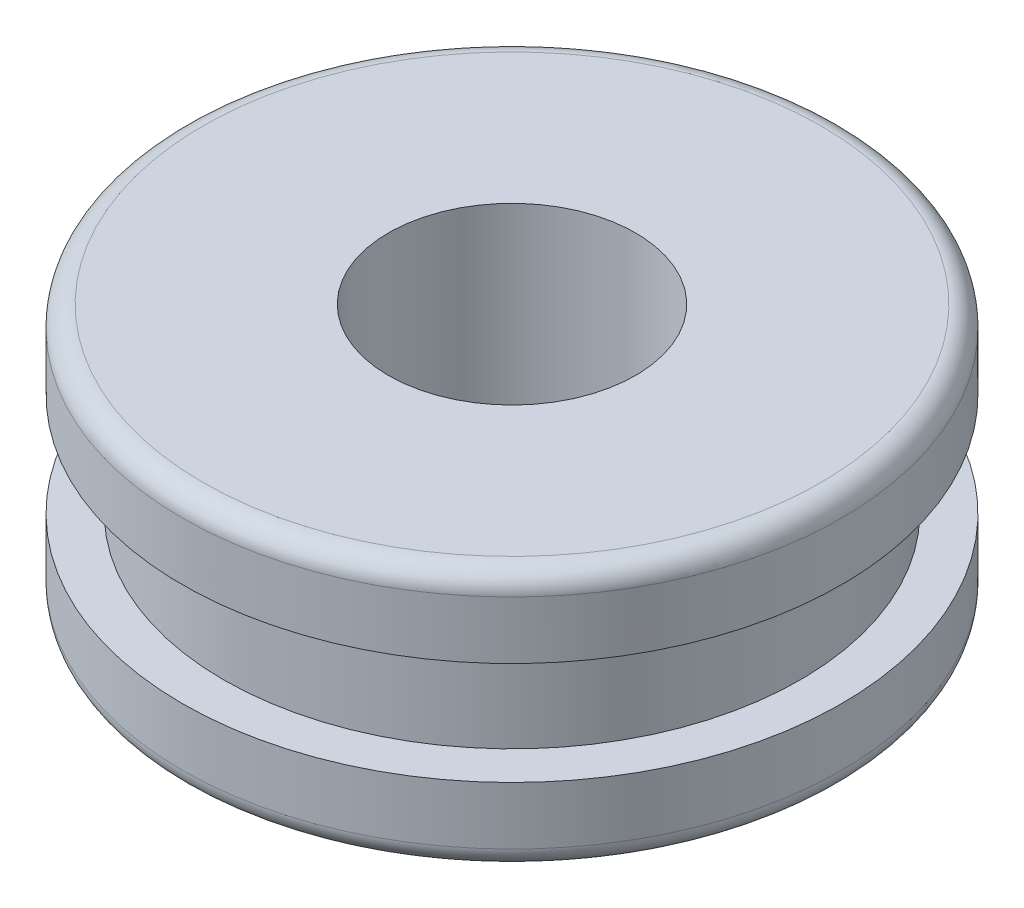
ISO-10303-21;
HEADER;
FILE_DESCRIPTION(('STEP AP214'),'2;1');
FILE_NAME('part.step','',(''),(''),'','','');
FILE_SCHEMA(('AUTOMOTIVE_DESIGN { 1 0 10303 214 1 1 1 1 }'));
ENDSEC;
DATA;
#1=APPLICATION_CONTEXT('core data for automotive mechanical design processes');
#2=APPLICATION_PROTOCOL_DEFINITION('international standard','automotive_design',2000,#1);
#3=PRODUCT_CONTEXT('',#1,'mechanical');
#4=PRODUCT('Part','Part','',(#3));
#5=PRODUCT_RELATED_PRODUCT_CATEGORY('part','',(#4));
#6=PRODUCT_DEFINITION_FORMATION('','',#4);
#7=PRODUCT_DEFINITION_CONTEXT('part definition',#1,'design');
#8=PRODUCT_DEFINITION('design','',#6,#7);
#9=PRODUCT_DEFINITION_SHAPE('','',#8);
#10=(LENGTH_UNIT() NAMED_UNIT(*) SI_UNIT(.MILLI.,.METRE.));
#11=(NAMED_UNIT(*) PLANE_ANGLE_UNIT() SI_UNIT($,.RADIAN.));
#12=(NAMED_UNIT(*) SI_UNIT($,.STERADIAN.) SOLID_ANGLE_UNIT());
#13=UNCERTAINTY_MEASURE_WITH_UNIT(LENGTH_MEASURE(1.E-05),#10,'distance_accuracy_value','');
#14=(GEOMETRIC_REPRESENTATION_CONTEXT(3) GLOBAL_UNCERTAINTY_ASSIGNED_CONTEXT((#13)) GLOBAL_UNIT_ASSIGNED_CONTEXT((#10,
#11,#12)) REPRESENTATION_CONTEXT('',''));
#15=CARTESIAN_POINT('',(0.,0.,0.));
#16=DIRECTION('',(0.,0.,1.));
#17=DIRECTION('',(1.,0.,0.));
#18=AXIS2_PLACEMENT_3D('',#15,#16,#17);
#19=CARTESIAN_POINT('',(0.,1.25,0.));
#20=DIRECTION('',(0.,-1.,0.));
#21=DIRECTION('',(0.,0.,-1.));
#22=AXIS2_PLACEMENT_3D('',#19,#20,#21);
#23=CYLINDRICAL_SURFACE('',#22,3.5);
#24=CARTESIAN_POINT('',(0.,1.25,0.));
#25=DIRECTION('',(0.,1.,0.));
#26=DIRECTION('',(0.,0.,1.));
#27=AXIS2_PLACEMENT_3D('',#24,#25,#26);
#28=CIRCLE('',#27,3.5);
#29=CARTESIAN_POINT('',(0.,1.25,3.5));
#30=VERTEX_POINT('',#29);
#31=EDGE_CURVE('E52',#30,#30,#28,.T.);
#32=ORIENTED_EDGE('',*,*,#31,.F.);
#33=EDGE_LOOP('',(#32));
#34=FACE_BOUND('',#33,.T.);
#35=CARTESIAN_POINT('',(0.,0.,0.));
#36=DIRECTION('',(0.,1.,0.));
#37=DIRECTION('',(0.,0.,1.));
#38=AXIS2_PLACEMENT_3D('',#35,#36,#37);
#39=CIRCLE('',#38,3.5);
#40=CARTESIAN_POINT('',(0.,0.,3.5));
#41=VERTEX_POINT('',#40);
#42=EDGE_CURVE('E53',#41,#41,#39,.T.);
#43=ORIENTED_EDGE('',*,*,#42,.T.);
#44=EDGE_LOOP('',(#43));
#45=FACE_BOUND('',#44,.T.);
#46=ADVANCED_FACE('F32',(#34,#45),#23,.T.);
#47=CARTESIAN_POINT('',(0.,2.2,0.));
#48=DIRECTION('',(0.,-1.,0.));
#49=DIRECTION('',(0.,0.,-1.));
#50=AXIS2_PLACEMENT_3D('',#47,#48,#49);
#51=CYLINDRICAL_SURFACE('',#50,4.);
#52=CARTESIAN_POINT('',(0.,1.95,0.));
#53=DIRECTION('',(0.,1.,0.));
#54=DIRECTION('',(0.,0.,1.));
#55=AXIS2_PLACEMENT_3D('',#52,#53,#54);
#56=CIRCLE('',#55,4.);
#57=CARTESIAN_POINT('',(0.,1.95,-4.));
#58=VERTEX_POINT('',#57);
#59=EDGE_CURVE('E43',#58,#58,#56,.F.);
#60=CARTESIAN_POINT('',(0.,1.25,0.));
#61=DIRECTION('',(0.,1.,0.));
#62=DIRECTION('',(0.,0.,1.));
#63=AXIS2_PLACEMENT_3D('',#60,#61,#62);
#64=CIRCLE('',#63,4.);
#65=CARTESIAN_POINT('',(0.,1.25,-4.));
#66=VERTEX_POINT('',#65);
#67=EDGE_CURVE('E56',#66,#66,#64,.T.);
#68=CARTESIAN_POINT('',(0.,1.95,-4.));
#69=CARTESIAN_POINT('',(0.,1.94270833333333,-4.));
#70=CARTESIAN_POINT('',(0.,1.93541666666667,-4.));
#71=CARTESIAN_POINT('',(0.,1.92083333333333,-4.));
#72=CARTESIAN_POINT('',(0.,1.91354166666667,-4.));
#73=CARTESIAN_POINT('',(0.,1.89895833333333,-4.));
#74=CARTESIAN_POINT('',(0.,1.89166666666667,-4.));
#75=CARTESIAN_POINT('',(0.,1.87708333333333,-4.));
#76=CARTESIAN_POINT('',(0.,1.86979166666667,-4.));
#77=CARTESIAN_POINT('',(0.,1.85520833333333,-4.));
#78=CARTESIAN_POINT('',(0.,1.84791666666667,-4.));
#79=CARTESIAN_POINT('',(0.,1.83333333333333,-4.));
#80=CARTESIAN_POINT('',(0.,1.82604166666667,-4.));
#81=CARTESIAN_POINT('',(0.,1.81145833333333,-4.));
#82=CARTESIAN_POINT('',(0.,1.80416666666667,-4.));
#83=CARTESIAN_POINT('',(0.,1.78958333333333,-4.));
#84=CARTESIAN_POINT('',(0.,1.78229166666667,-4.));
#85=CARTESIAN_POINT('',(0.,1.76770833333333,-4.));
#86=CARTESIAN_POINT('',(0.,1.76041666666667,-4.));
#87=CARTESIAN_POINT('',(0.,1.74583333333333,-4.));
#88=CARTESIAN_POINT('',(0.,1.73854166666667,-4.));
#89=CARTESIAN_POINT('',(0.,1.72395833333333,-4.));
#90=CARTESIAN_POINT('',(0.,1.71666666666667,-4.));
#91=CARTESIAN_POINT('',(0.,1.70208333333333,-4.));
#92=CARTESIAN_POINT('',(0.,1.69479166666667,-4.));
#93=CARTESIAN_POINT('',(0.,1.68020833333333,-4.));
#94=CARTESIAN_POINT('',(0.,1.67291666666667,-4.));
#95=CARTESIAN_POINT('',(0.,1.65833333333333,-4.));
#96=CARTESIAN_POINT('',(0.,1.65104166666667,-4.));
#97=CARTESIAN_POINT('',(0.,1.63645833333333,-4.));
#98=CARTESIAN_POINT('',(0.,1.62916666666667,-4.));
#99=CARTESIAN_POINT('',(0.,1.61458333333333,-4.));
#100=CARTESIAN_POINT('',(0.,1.60729166666667,-4.));
#101=CARTESIAN_POINT('',(0.,1.59270833333333,-4.));
#102=CARTESIAN_POINT('',(0.,1.58541666666667,-4.));
#103=CARTESIAN_POINT('',(0.,1.57083333333333,-4.));
#104=CARTESIAN_POINT('',(0.,1.56354166666667,-4.));
#105=CARTESIAN_POINT('',(0.,1.54895833333333,-4.));
#106=CARTESIAN_POINT('',(0.,1.54166666666667,-4.));
#107=CARTESIAN_POINT('',(0.,1.52708333333333,-4.));
#108=CARTESIAN_POINT('',(0.,1.51979166666667,-4.));
#109=CARTESIAN_POINT('',(0.,1.50520833333333,-4.));
#110=CARTESIAN_POINT('',(0.,1.49791666666667,-4.));
#111=CARTESIAN_POINT('',(0.,1.48333333333333,-4.));
#112=CARTESIAN_POINT('',(0.,1.47604166666667,-4.));
#113=CARTESIAN_POINT('',(0.,1.46145833333333,-4.));
#114=CARTESIAN_POINT('',(0.,1.45416666666667,-4.));
#115=CARTESIAN_POINT('',(0.,1.43958333333333,-4.));
#116=CARTESIAN_POINT('',(0.,1.43229166666667,-4.));
#117=CARTESIAN_POINT('',(0.,1.41770833333333,-4.));
#118=CARTESIAN_POINT('',(0.,1.41041666666667,-4.));
#119=CARTESIAN_POINT('',(0.,1.39583333333333,-4.));
#120=CARTESIAN_POINT('',(0.,1.38854166666667,-4.));
#121=CARTESIAN_POINT('',(0.,1.37395833333333,-4.));
#122=CARTESIAN_POINT('',(0.,1.36666666666667,-4.));
#123=CARTESIAN_POINT('',(0.,1.35208333333333,-4.));
#124=CARTESIAN_POINT('',(0.,1.34479166666667,-4.));
#125=CARTESIAN_POINT('',(0.,1.33020833333333,-4.));
#126=CARTESIAN_POINT('',(0.,1.32291666666667,-4.));
#127=CARTESIAN_POINT('',(0.,1.30833333333333,-4.));
#128=CARTESIAN_POINT('',(0.,1.30104166666667,-4.));
#129=CARTESIAN_POINT('',(0.,1.28645833333333,-4.));
#130=CARTESIAN_POINT('',(0.,1.27916666666667,-4.));
#131=CARTESIAN_POINT('',(0.,1.26458333333333,-4.));
#132=CARTESIAN_POINT('',(0.,1.25729166666667,-4.));
#133=CARTESIAN_POINT('',(0.,1.25,-4.));
#134=B_SPLINE_CURVE_WITH_KNOTS('',3,(#68,#69,#70,#71,#72,#73,#74,#75,#76,#77,#78,#79,#80,#81,
#82,#83,#84,#85,#86,#87,#88,#89,#90,#91,#92,#93,#94,#95,#96,#97,#98,#99,#100,#101,#102,#103,
#104,#105,#106,#107,#108,#109,#110,#111,#112,#113,#114,#115,#116,#117,#118,#119,#120,#121,#122,
#123,#124,#125,#126,#127,#128,#129,#130,#131,#132,#133),.UNSPECIFIED.,.F.,.F.,(4,2,2,2,2,2,2,2,
2,2,2,2,2,2,2,2,2,2,2,2,2,2,2,2,2,2,2,2,2,2,2,2,4),(0.,0.021875,0.0437500000000002,
0.0656250000000001,0.0875000000000001,0.109375,0.13125,0.153125,0.175,0.196875,0.21875,0.240625,
0.2625,0.284375,0.30625,0.328125,0.35,0.371875,0.39375,0.415625,0.4375,0.459375,0.48125,
0.503125,0.525,0.546875,0.56875,0.590625,0.6125,0.634375,0.65625,0.678125,0.7),.UNSPECIFIED.);
#135=EDGE_CURVE('BSEAM83',#58,#66,#134,.T.);
#136=ORIENTED_EDGE('',*,*,#59,.T.);
#137=ORIENTED_EDGE('',*,*,#67,.T.);
#138=ORIENTED_EDGE('',*,*,#135,.T.);
#139=ORIENTED_EDGE('',*,*,#135,.F.);
#140=EDGE_LOOP('',(#136,#138,#137,#139));
#141=FACE_BOUND('',#140,.T.);
#142=ADVANCED_FACE('F83',(#141),#51,.T.);
#143=CARTESIAN_POINT('',(0.,2.2,0.));
#144=DIRECTION('',(0.,1.,0.));
#145=DIRECTION('',(0.,0.,1.));
#146=AXIS2_PLACEMENT_3D('',#143,#144,#145);
#147=PLANE('',#146);
#148=CARTESIAN_POINT('',(0.,2.2,0.));
#149=DIRECTION('',(0.,1.,0.));
#150=DIRECTION('',(0.,0.,1.));
#151=AXIS2_PLACEMENT_3D('',#148,#149,#150);
#152=CIRCLE('',#151,1.5);
#153=CARTESIAN_POINT('',(0.,2.2,1.5));
#154=VERTEX_POINT('',#153);
#155=EDGE_CURVE('E65',#154,#154,#152,.T.);
#156=ORIENTED_EDGE('',*,*,#155,.F.);
#157=EDGE_LOOP('',(#156));
#158=FACE_BOUND('',#157,.T.);
#159=CARTESIAN_POINT('',(0.,2.2,0.));
#160=DIRECTION('',(0.,1.,0.));
#161=DIRECTION('',(0.,0.,1.));
#162=AXIS2_PLACEMENT_3D('',#159,#160,#161);
#163=CIRCLE('',#162,3.75);
#164=CARTESIAN_POINT('',(0.,2.2,3.75));
#165=VERTEX_POINT('',#164);
#166=EDGE_CURVE('E47',#165,#165,#163,.T.);
#167=ORIENTED_EDGE('',*,*,#166,.T.);
#168=EDGE_LOOP('',(#167));
#169=FACE_BOUND('',#168,.T.);
#170=ADVANCED_FACE('F79',(#158,#169),#147,.T.);
#171=CARTESIAN_POINT('',(0.,1.25,0.));
#172=DIRECTION('',(0.,1.,0.));
#173=DIRECTION('',(0.,0.,1.));
#174=AXIS2_PLACEMENT_3D('',#171,#172,#173);
#175=PLANE('',#174);
#176=ORIENTED_EDGE('',*,*,#31,.T.);
#177=EDGE_LOOP('',(#176));
#178=FACE_BOUND('',#177,.T.);
#179=ORIENTED_EDGE('',*,*,#67,.F.);
#180=EDGE_LOOP('',(#179));
#181=FACE_BOUND('',#180,.T.);
#182=ADVANCED_FACE('F82',(#178,#181),#175,.F.);
#183=CARTESIAN_POINT('',(0.,1.95,0.));
#184=DIRECTION('',(0.,1.,0.));
#185=DIRECTION('',(0.,0.,1.));
#186=AXIS2_PLACEMENT_3D('',#183,#184,#185);
#187=TOROIDAL_SURFACE('',#186,3.75,0.25);
#188=ORIENTED_EDGE('',*,*,#59,.F.);
#189=EDGE_LOOP('',(#188));
#190=FACE_BOUND('',#189,.T.);
#191=ORIENTED_EDGE('',*,*,#166,.F.);
#192=EDGE_LOOP('',(#191));
#193=FACE_BOUND('',#192,.T.);
#194=ADVANCED_FACE('F87',(#190,#193),#187,.T.);
#195=CARTESIAN_POINT('',(0.,-0.95,0.));
#196=DIRECTION('',(0.,1.,0.));
#197=DIRECTION('',(0.,0.,1.));
#198=AXIS2_PLACEMENT_3D('',#195,#196,#197);
#199=CYLINDRICAL_SURFACE('',#198,4.);
#200=CARTESIAN_POINT('',(0.,-0.7,0.));
#201=DIRECTION('',(0.,-1.,0.));
#202=DIRECTION('',(0.,0.,-1.));
#203=AXIS2_PLACEMENT_3D('',#200,#201,#202);
#204=CIRCLE('',#203,4.);
#205=CARTESIAN_POINT('',(0.,-0.7,4.));
#206=VERTEX_POINT('',#205);
#207=EDGE_CURVE('E39',#206,#206,#204,.F.);
#208=CARTESIAN_POINT('',(0.,0.,0.));
#209=DIRECTION('',(0.,1.,0.));
#210=DIRECTION('',(0.,0.,1.));
#211=AXIS2_PLACEMENT_3D('',#208,#209,#210);
#212=CIRCLE('',#211,4.);
#213=CARTESIAN_POINT('',(0.,0.,4.));
#214=VERTEX_POINT('',#213);
#215=EDGE_CURVE('E57',#214,#214,#212,.T.);
#216=CARTESIAN_POINT('',(0.,-0.7,4.));
#217=CARTESIAN_POINT('',(0.,-0.692708333333333,4.));
#218=CARTESIAN_POINT('',(0.,-0.685416666666667,4.));
#219=CARTESIAN_POINT('',(0.,-0.670833333333333,4.));
#220=CARTESIAN_POINT('',(0.,-0.663541666666667,4.));
#221=CARTESIAN_POINT('',(0.,-0.648958333333333,4.));
#222=CARTESIAN_POINT('',(0.,-0.641666666666667,4.));
#223=CARTESIAN_POINT('',(0.,-0.627083333333333,4.));
#224=CARTESIAN_POINT('',(0.,-0.619791666666667,4.));
#225=CARTESIAN_POINT('',(0.,-0.605208333333333,4.));
#226=CARTESIAN_POINT('',(0.,-0.597916666666667,4.));
#227=CARTESIAN_POINT('',(0.,-0.583333333333333,4.));
#228=CARTESIAN_POINT('',(0.,-0.576041666666667,4.));
#229=CARTESIAN_POINT('',(0.,-0.561458333333333,4.));
#230=CARTESIAN_POINT('',(0.,-0.554166666666667,4.));
#231=CARTESIAN_POINT('',(0.,-0.539583333333333,4.));
#232=CARTESIAN_POINT('',(0.,-0.532291666666667,4.));
#233=CARTESIAN_POINT('',(0.,-0.517708333333333,4.));
#234=CARTESIAN_POINT('',(0.,-0.510416666666667,4.));
#235=CARTESIAN_POINT('',(0.,-0.495833333333333,4.));
#236=CARTESIAN_POINT('',(0.,-0.488541666666667,4.));
#237=CARTESIAN_POINT('',(0.,-0.473958333333333,4.));
#238=CARTESIAN_POINT('',(0.,-0.466666666666667,4.));
#239=CARTESIAN_POINT('',(0.,-0.452083333333333,4.));
#240=CARTESIAN_POINT('',(0.,-0.444791666666667,4.));
#241=CARTESIAN_POINT('',(0.,-0.430208333333333,4.));
#242=CARTESIAN_POINT('',(0.,-0.422916666666667,4.));
#243=CARTESIAN_POINT('',(0.,-0.408333333333333,4.));
#244=CARTESIAN_POINT('',(0.,-0.401041666666667,4.));
#245=CARTESIAN_POINT('',(0.,-0.386458333333333,4.));
#246=CARTESIAN_POINT('',(0.,-0.379166666666667,4.));
#247=CARTESIAN_POINT('',(0.,-0.364583333333333,4.));
#248=CARTESIAN_POINT('',(0.,-0.357291666666667,4.));
#249=CARTESIAN_POINT('',(0.,-0.342708333333333,4.));
#250=CARTESIAN_POINT('',(0.,-0.335416666666667,4.));
#251=CARTESIAN_POINT('',(0.,-0.320833333333333,4.));
#252=CARTESIAN_POINT('',(0.,-0.313541666666667,4.));
#253=CARTESIAN_POINT('',(0.,-0.298958333333333,4.));
#254=CARTESIAN_POINT('',(0.,-0.291666666666667,4.));
#255=CARTESIAN_POINT('',(0.,-0.277083333333333,4.));
#256=CARTESIAN_POINT('',(0.,-0.269791666666667,4.));
#257=CARTESIAN_POINT('',(0.,-0.255208333333333,4.));
#258=CARTESIAN_POINT('',(0.,-0.247916666666667,4.));
#259=CARTESIAN_POINT('',(0.,-0.233333333333333,4.));
#260=CARTESIAN_POINT('',(0.,-0.226041666666667,4.));
#261=CARTESIAN_POINT('',(0.,-0.211458333333333,4.));
#262=CARTESIAN_POINT('',(0.,-0.204166666666667,4.));
#263=CARTESIAN_POINT('',(0.,-0.189583333333333,4.));
#264=CARTESIAN_POINT('',(0.,-0.182291666666667,4.));
#265=CARTESIAN_POINT('',(0.,-0.167708333333333,4.));
#266=CARTESIAN_POINT('',(0.,-0.160416666666667,4.));
#267=CARTESIAN_POINT('',(0.,-0.145833333333333,4.));
#268=CARTESIAN_POINT('',(0.,-0.138541666666667,4.));
#269=CARTESIAN_POINT('',(0.,-0.123958333333333,4.));
#270=CARTESIAN_POINT('',(0.,-0.116666666666667,4.));
#271=CARTESIAN_POINT('',(0.,-0.102083333333333,4.));
#272=CARTESIAN_POINT('',(0.,-0.0947916666666667,4.));
#273=CARTESIAN_POINT('',(0.,-0.0802083333333334,4.));
#274=CARTESIAN_POINT('',(0.,-0.0729166666666667,4.));
#275=CARTESIAN_POINT('',(0.,-0.0583333333333333,4.));
#276=CARTESIAN_POINT('',(0.,-0.0510416666666667,4.));
#277=CARTESIAN_POINT('',(0.,-0.0364583333333333,4.));
#278=CARTESIAN_POINT('',(0.,-0.0291666666666666,4.));
#279=CARTESIAN_POINT('',(0.,-0.0145833333333333,4.));
#280=CARTESIAN_POINT('',(0.,-0.00729166666666665,4.));
#281=CARTESIAN_POINT('',(0.,0.,4.));
#282=B_SPLINE_CURVE_WITH_KNOTS('',3,(#216,#217,#218,#219,#220,#221,#222,#223,#224,#225,#226,
#227,#228,#229,#230,#231,#232,#233,#234,#235,#236,#237,#238,#239,#240,#241,#242,#243,#244,#245,
#246,#247,#248,#249,#250,#251,#252,#253,#254,#255,#256,#257,#258,#259,#260,#261,#262,#263,#264,
#265,#266,#267,#268,#269,#270,#271,#272,#273,#274,#275,#276,#277,#278,#279,#280,#281),
.UNSPECIFIED.,.F.,.F.,(4,2,2,2,2,2,2,2,2,2,2,2,2,2,2,2,2,2,2,2,2,2,2,2,2,2,2,2,2,2,2,2,4),(0.,
0.021875,0.04375,0.0656249999999999,0.0874999999999999,0.109375,0.13125,0.153125,0.175,0.196875,
0.21875,0.240625,0.2625,0.284375,0.30625,0.328125,0.35,0.371875,0.39375,0.415625,0.4375,
0.459375,0.48125,0.503125,0.525,0.546875,0.56875,0.590625,0.6125,0.634375,0.65625,0.678125,0.7),.UNSPECIFIED.);
#283=EDGE_CURVE('BSEAM89',#206,#214,#282,.T.);
#284=ORIENTED_EDGE('',*,*,#207,.T.);
#285=ORIENTED_EDGE('',*,*,#215,.F.);
#286=ORIENTED_EDGE('',*,*,#283,.T.);
#287=ORIENTED_EDGE('',*,*,#283,.F.);
#288=EDGE_LOOP('',(#284,#286,#285,#287));
#289=FACE_BOUND('',#288,.T.);
#290=ADVANCED_FACE('F89',(#289),#199,.T.);
#291=CARTESIAN_POINT('',(0.,-0.95,0.));
#292=DIRECTION('',(0.,-1.,0.));
#293=DIRECTION('',(0.,0.,1.));
#294=AXIS2_PLACEMENT_3D('',#291,#292,#293);
#295=PLANE('',#294);
#296=CARTESIAN_POINT('',(0.,-0.95,0.));
#297=DIRECTION('',(0.,1.,0.));
#298=DIRECTION('',(0.,0.,1.));
#299=AXIS2_PLACEMENT_3D('',#296,#297,#298);
#300=CIRCLE('',#299,1.5);
#301=CARTESIAN_POINT('',(0.,-0.95,1.5));
#302=VERTEX_POINT('',#301);
#303=EDGE_CURVE('E64',#302,#302,#300,.T.);
#304=ORIENTED_EDGE('',*,*,#303,.T.);
#305=EDGE_LOOP('',(#304));
#306=FACE_BOUND('',#305,.T.);
#307=CARTESIAN_POINT('',(0.,-0.95,0.));
#308=DIRECTION('',(0.,-1.,0.));
#309=DIRECTION('',(0.,0.,-1.));
#310=AXIS2_PLACEMENT_3D('',#307,#308,#309);
#311=CIRCLE('',#310,3.75);
#312=CARTESIAN_POINT('',(0.,-0.95,-3.75));
#313=VERTEX_POINT('',#312);
#314=EDGE_CURVE('E10',#313,#313,#311,.T.);
#315=ORIENTED_EDGE('',*,*,#314,.T.);
#316=EDGE_LOOP('',(#315));
#317=FACE_BOUND('',#316,.T.);
#318=ADVANCED_FACE('F71',(#306,#317),#295,.T.);
#319=CARTESIAN_POINT('',(0.,0.,0.));
#320=DIRECTION('',(0.,-1.,0.));
#321=DIRECTION('',(0.,0.,1.));
#322=AXIS2_PLACEMENT_3D('',#319,#320,#321);
#323=PLANE('',#322);
#324=ORIENTED_EDGE('',*,*,#42,.F.);
#325=EDGE_LOOP('',(#324));
#326=FACE_BOUND('',#325,.T.);
#327=ORIENTED_EDGE('',*,*,#215,.T.);
#328=EDGE_LOOP('',(#327));
#329=FACE_BOUND('',#328,.T.);
#330=ADVANCED_FACE('F110',(#326,#329),#323,.F.);
#331=CARTESIAN_POINT('',(0.,-0.7,0.));
#332=DIRECTION('',(0.,-1.,0.));
#333=DIRECTION('',(0.,0.,-1.));
#334=AXIS2_PLACEMENT_3D('',#331,#332,#333);
#335=TOROIDAL_SURFACE('',#334,3.75,0.25);
#336=ORIENTED_EDGE('',*,*,#314,.F.);
#337=EDGE_LOOP('',(#336));
#338=FACE_BOUND('',#337,.T.);
#339=ORIENTED_EDGE('',*,*,#207,.F.);
#340=EDGE_LOOP('',(#339));
#341=FACE_BOUND('',#340,.T.);
#342=ADVANCED_FACE('F34',(#338,#341),#335,.T.);
#343=CARTESIAN_POINT('',(0.,-0.95,0.));
#344=DIRECTION('',(0.,1.,0.));
#345=DIRECTION('',(0.,0.,1.));
#346=AXIS2_PLACEMENT_3D('',#343,#344,#345);
#347=CYLINDRICAL_SURFACE('',#346,1.5);
#348=ORIENTED_EDGE('',*,*,#303,.F.);
#349=EDGE_LOOP('',(#348));
#350=FACE_BOUND('',#349,.T.);
#351=ORIENTED_EDGE('',*,*,#155,.T.);
#352=EDGE_LOOP('',(#351));
#353=FACE_BOUND('',#352,.T.);
#354=ADVANCED_FACE('F73',(#350,#353),#347,.F.);
#355=CLOSED_SHELL('',(#46,#142,#170,#182,#194,#290,#318,#330,#342,#354));
#356=MANIFOLD_SOLID_BREP('B2',#355);
#357=ADVANCED_BREP_SHAPE_REPRESENTATION('',(#18,#356),#14);
#358=SHAPE_DEFINITION_REPRESENTATION(#9,#357);
ENDSEC;
END-ISO-10303-21;
